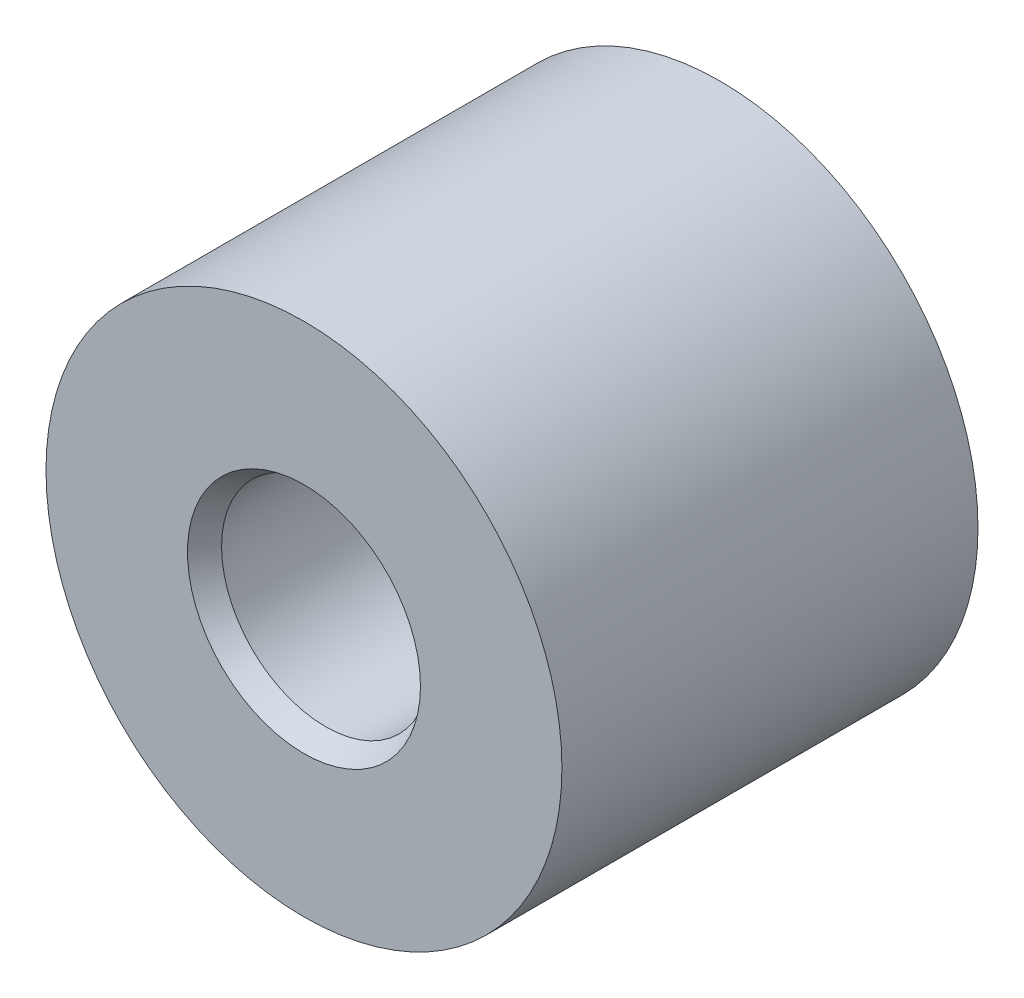
ISO-10303-21;
HEADER;
FILE_DESCRIPTION(('STEP AP214'),'2;1');
FILE_NAME('part.step','',(''),(''),'','','');
FILE_SCHEMA(('AUTOMOTIVE_DESIGN { 1 0 10303 214 1 1 1 1 }'));
ENDSEC;
DATA;
#1=APPLICATION_CONTEXT('core data for automotive mechanical design processes');
#2=APPLICATION_PROTOCOL_DEFINITION('international standard','automotive_design',2000,#1);
#3=PRODUCT_CONTEXT('',#1,'mechanical');
#4=PRODUCT('Part','Part','',(#3));
#5=PRODUCT_RELATED_PRODUCT_CATEGORY('part','',(#4));
#6=PRODUCT_DEFINITION_FORMATION('','',#4);
#7=PRODUCT_DEFINITION_CONTEXT('part definition',#1,'design');
#8=PRODUCT_DEFINITION('design','',#6,#7);
#9=PRODUCT_DEFINITION_SHAPE('','',#8);
#10=(LENGTH_UNIT() NAMED_UNIT(*) SI_UNIT(.MILLI.,.METRE.));
#11=(NAMED_UNIT(*) PLANE_ANGLE_UNIT() SI_UNIT($,.RADIAN.));
#12=(NAMED_UNIT(*) SI_UNIT($,.STERADIAN.) SOLID_ANGLE_UNIT());
#13=UNCERTAINTY_MEASURE_WITH_UNIT(LENGTH_MEASURE(1.E-05),#10,'distance_accuracy_value','');
#14=(GEOMETRIC_REPRESENTATION_CONTEXT(3) GLOBAL_UNCERTAINTY_ASSIGNED_CONTEXT((#13)) GLOBAL_UNIT_ASSIGNED_CONTEXT((#10,
#11,#12)) REPRESENTATION_CONTEXT('',''));
#15=CARTESIAN_POINT('',(0.,0.,0.));
#16=DIRECTION('',(0.,0.,1.));
#17=DIRECTION('',(1.,0.,0.));
#18=AXIS2_PLACEMENT_3D('',#15,#16,#17);
#19=CARTESIAN_POINT('',(0.,0.,-5.));
#20=DIRECTION('',(0.,0.,1.));
#21=DIRECTION('',(1.,0.,0.));
#22=AXIS2_PLACEMENT_3D('',#19,#20,#21);
#23=CYLINDRICAL_SURFACE('',#22,3.1);
#24=CARTESIAN_POINT('',(0.,0.,-5.));
#25=DIRECTION('',(0.,0.,1.));
#26=DIRECTION('',(1.,0.,0.));
#27=AXIS2_PLACEMENT_3D('',#24,#25,#26);
#28=CIRCLE('',#27,3.1);
#29=CARTESIAN_POINT('',(3.1,0.,-5.));
#30=VERTEX_POINT('',#29);
#31=EDGE_CURVE('E10',#30,#30,#28,.T.);
#32=ORIENTED_EDGE('',*,*,#31,.T.);
#33=EDGE_LOOP('',(#32));
#34=FACE_BOUND('',#33,.T.);
#35=CARTESIAN_POINT('',(0.,0.,0.));
#36=DIRECTION('',(0.,0.,1.));
#37=DIRECTION('',(1.,0.,0.));
#38=AXIS2_PLACEMENT_3D('',#35,#36,#37);
#39=CIRCLE('',#38,3.1);
#40=CARTESIAN_POINT('',(3.1,0.,0.));
#41=VERTEX_POINT('',#40);
#42=EDGE_CURVE('E34',#41,#41,#39,.T.);
#43=ORIENTED_EDGE('',*,*,#42,.F.);
#44=EDGE_LOOP('',(#43));
#45=FACE_BOUND('',#44,.T.);
#46=ADVANCED_FACE('F31',(#34,#45),#23,.T.);
#47=CARTESIAN_POINT('',(0.,0.,-5.));
#48=DIRECTION('',(0.,0.,1.));
#49=DIRECTION('',(1.,0.,0.));
#50=AXIS2_PLACEMENT_3D('',#47,#48,#49);
#51=PLANE('',#50);
#52=CARTESIAN_POINT('',(0.,0.,-5.));
#53=DIRECTION('',(0.,0.,1.));
#54=DIRECTION('',(1.,0.,0.));
#55=AXIS2_PLACEMENT_3D('',#52,#53,#54);
#56=CIRCLE('',#55,1.25);
#57=CARTESIAN_POINT('',(1.25,0.,-5.));
#58=VERTEX_POINT('',#57);
#59=EDGE_CURVE('E41',#58,#58,#56,.T.);
#60=ORIENTED_EDGE('',*,*,#59,.T.);
#61=EDGE_LOOP('',(#60));
#62=FACE_BOUND('',#61,.T.);
#63=ORIENTED_EDGE('',*,*,#31,.F.);
#64=EDGE_LOOP('',(#63));
#65=FACE_BOUND('',#64,.T.);
#66=ADVANCED_FACE('F58',(#62,#65),#51,.F.);
#67=CARTESIAN_POINT('',(0.,0.,0.));
#68=DIRECTION('',(0.,0.,1.));
#69=DIRECTION('',(1.,0.,0.));
#70=AXIS2_PLACEMENT_3D('',#67,#68,#69);
#71=PLANE('',#70);
#72=CARTESIAN_POINT('',(0.,0.,0.));
#73=DIRECTION('',(0.,0.,1.));
#74=DIRECTION('',(1.,0.,0.));
#75=AXIS2_PLACEMENT_3D('',#72,#73,#74);
#76=CIRCLE('',#75,1.4);
#77=CARTESIAN_POINT('',(1.4,0.,0.));
#78=VERTEX_POINT('',#77);
#79=EDGE_CURVE('E48',#78,#78,#76,.T.);
#80=ORIENTED_EDGE('',*,*,#79,.F.);
#81=EDGE_LOOP('',(#80));
#82=FACE_BOUND('',#81,.T.);
#83=ORIENTED_EDGE('',*,*,#42,.T.);
#84=EDGE_LOOP('',(#83));
#85=FACE_BOUND('',#84,.T.);
#86=ADVANCED_FACE('F54',(#82,#85),#71,.T.);
#87=CARTESIAN_POINT('',(0.,0.,0.));
#88=DIRECTION('',(0.,0.,1.));
#89=DIRECTION('',(1.,0.,0.));
#90=AXIS2_PLACEMENT_3D('',#87,#88,#89);
#91=CYLINDRICAL_SURFACE('',#90,1.25);
#92=ORIENTED_EDGE('',*,*,#59,.F.);
#93=EDGE_LOOP('',(#92));
#94=FACE_BOUND('',#93,.T.);
#95=CARTESIAN_POINT('',(0.,0.,-0.259807621135331));
#96=DIRECTION('',(0.,0.,1.));
#97=DIRECTION('',(1.,0.,0.));
#98=AXIS2_PLACEMENT_3D('',#95,#96,#97);
#99=CIRCLE('',#98,1.25);
#100=CARTESIAN_POINT('',(1.25,0.,-0.259807621135331));
#101=VERTEX_POINT('',#100);
#102=EDGE_CURVE('E45',#101,#101,#99,.T.);
#103=ORIENTED_EDGE('',*,*,#102,.T.);
#104=EDGE_LOOP('',(#103));
#105=FACE_BOUND('',#104,.T.);
#106=ADVANCED_FACE('F57',(#94,#105),#91,.F.);
#107=CARTESIAN_POINT('',(0.,0.,0.));
#108=DIRECTION('',(0.,0.,1.));
#109=DIRECTION('',(1.,0.,0.));
#110=AXIS2_PLACEMENT_3D('',#107,#108,#109);
#111=CONICAL_SURFACE('',#110,1.4,0.5235987755983);
#112=ORIENTED_EDGE('',*,*,#102,.F.);
#113=EDGE_LOOP('',(#112));
#114=FACE_BOUND('',#113,.T.);
#115=ORIENTED_EDGE('',*,*,#79,.T.);
#116=EDGE_LOOP('',(#115));
#117=FACE_BOUND('',#116,.T.);
#118=ADVANCED_FACE('F52',(#114,#117),#111,.F.);
#119=CLOSED_SHELL('',(#46,#66,#86,#106,#118));
#120=MANIFOLD_SOLID_BREP('B2',#119);
#121=ADVANCED_BREP_SHAPE_REPRESENTATION('',(#18,#120),#14);
#122=SHAPE_DEFINITION_REPRESENTATION(#9,#121);
ENDSEC;
END-ISO-10303-21;
